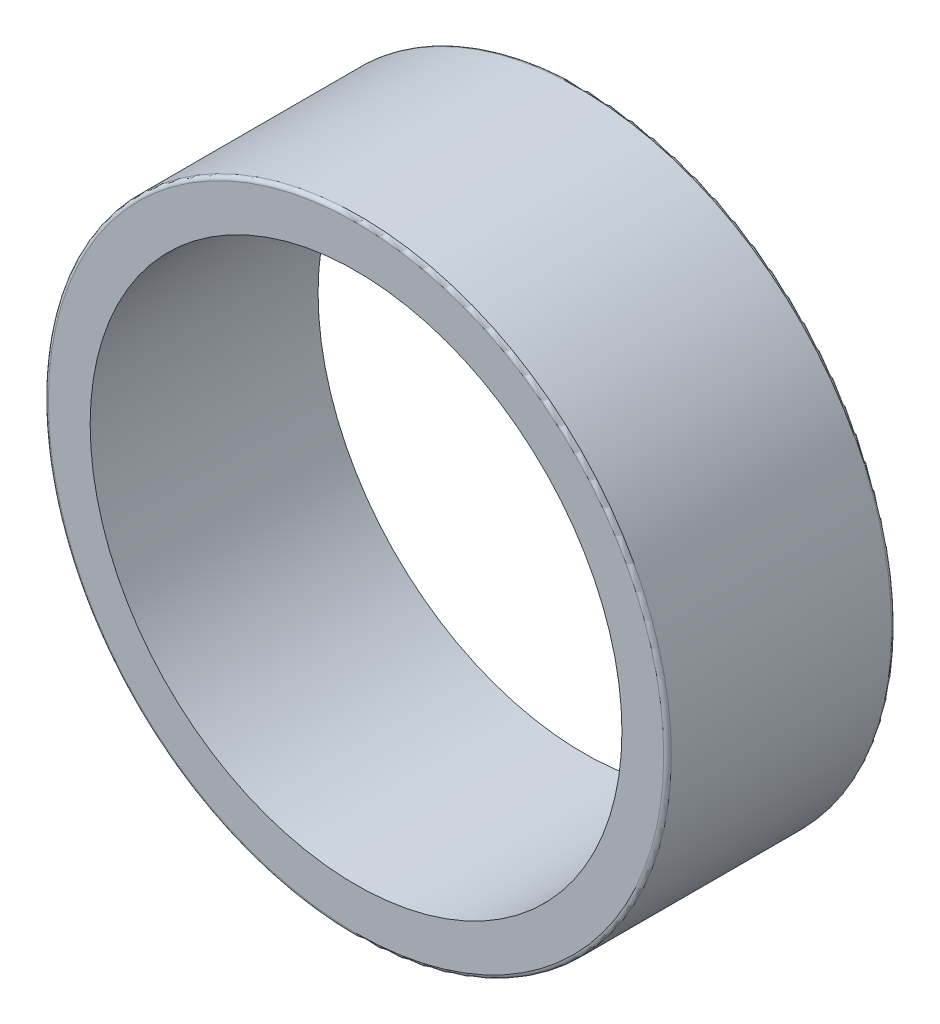
ISO-10303-21;
HEADER;
FILE_DESCRIPTION(('STEP AP214'),'2;1');
FILE_NAME('part.step','',(''),(''),'','','');
FILE_SCHEMA(('AUTOMOTIVE_DESIGN { 1 0 10303 214 1 1 1 1 }'));
ENDSEC;
DATA;
#1=APPLICATION_CONTEXT('core data for automotive mechanical design processes');
#2=APPLICATION_PROTOCOL_DEFINITION('international standard','automotive_design',2000,#1);
#3=PRODUCT_CONTEXT('',#1,'mechanical');
#4=PRODUCT('Part','Part','',(#3));
#5=PRODUCT_RELATED_PRODUCT_CATEGORY('part','',(#4));
#6=PRODUCT_DEFINITION_FORMATION('','',#4);
#7=PRODUCT_DEFINITION_CONTEXT('part definition',#1,'design');
#8=PRODUCT_DEFINITION('design','',#6,#7);
#9=PRODUCT_DEFINITION_SHAPE('','',#8);
#10=(LENGTH_UNIT() NAMED_UNIT(*) SI_UNIT(.MILLI.,.METRE.));
#11=(NAMED_UNIT(*) PLANE_ANGLE_UNIT() SI_UNIT($,.RADIAN.));
#12=(NAMED_UNIT(*) SI_UNIT($,.STERADIAN.) SOLID_ANGLE_UNIT());
#13=UNCERTAINTY_MEASURE_WITH_UNIT(LENGTH_MEASURE(1.E-05),#10,'distance_accuracy_value','');
#14=(GEOMETRIC_REPRESENTATION_CONTEXT(3) GLOBAL_UNCERTAINTY_ASSIGNED_CONTEXT((#13)) GLOBAL_UNIT_ASSIGNED_CONTEXT((#10,
#11,#12)) REPRESENTATION_CONTEXT('',''));
#15=CARTESIAN_POINT('',(0.,0.,0.));
#16=DIRECTION('',(0.,0.,1.));
#17=DIRECTION('',(1.,0.,0.));
#18=AXIS2_PLACEMENT_3D('',#15,#16,#17);
#19=CARTESIAN_POINT('',(0.,0.,1.5));
#20=DIRECTION('',(0.,0.,1.));
#21=DIRECTION('',(1.,0.,0.));
#22=AXIS2_PLACEMENT_3D('',#19,#20,#21);
#23=PLANE('',#22);
#24=CARTESIAN_POINT('',(0.,0.,1.5));
#25=DIRECTION('',(0.,0.,1.));
#26=DIRECTION('',(1.,0.,0.));
#27=AXIS2_PLACEMENT_3D('',#24,#25,#26);
#28=CIRCLE('',#27,4.05);
#29=CARTESIAN_POINT('',(4.05,0.,1.5));
#30=VERTEX_POINT('',#29);
#31=EDGE_CURVE('E10',#30,#30,#28,.T.);
#32=ORIENTED_EDGE('',*,*,#31,.T.);
#33=EDGE_LOOP('',(#32));
#34=FACE_BOUND('',#33,.T.);
#35=CARTESIAN_POINT('',(0.,0.,1.5));
#36=DIRECTION('',(0.,0.,1.));
#37=DIRECTION('',(1.,0.,0.));
#38=AXIS2_PLACEMENT_3D('',#35,#36,#37);
#39=CIRCLE('',#38,3.5);
#40=CARTESIAN_POINT('',(3.5,0.,1.5));
#41=VERTEX_POINT('',#40);
#42=EDGE_CURVE('E54',#41,#41,#39,.T.);
#43=ORIENTED_EDGE('',*,*,#42,.F.);
#44=EDGE_LOOP('',(#43));
#45=FACE_BOUND('',#44,.T.);
#46=ADVANCED_FACE('F34',(#34,#45),#23,.T.);
#47=CARTESIAN_POINT('',(0.,0.,-1.5));
#48=DIRECTION('',(0.,0.,1.));
#49=DIRECTION('',(1.,0.,0.));
#50=AXIS2_PLACEMENT_3D('',#47,#48,#49);
#51=PLANE('',#50);
#52=CARTESIAN_POINT('',(0.,0.,-1.5));
#53=DIRECTION('',(0.,0.,1.));
#54=DIRECTION('',(1.,0.,0.));
#55=AXIS2_PLACEMENT_3D('',#52,#53,#54);
#56=CIRCLE('',#55,4.05);
#57=CARTESIAN_POINT('',(4.05,0.,-1.5));
#58=VERTEX_POINT('',#57);
#59=EDGE_CURVE('E41',#58,#58,#56,.F.);
#60=ORIENTED_EDGE('',*,*,#59,.T.);
#61=EDGE_LOOP('',(#60));
#62=FACE_BOUND('',#61,.T.);
#63=CARTESIAN_POINT('',(0.,0.,-1.5));
#64=DIRECTION('',(0.,0.,1.));
#65=DIRECTION('',(1.,0.,0.));
#66=AXIS2_PLACEMENT_3D('',#63,#64,#65);
#67=CIRCLE('',#66,3.5);
#68=CARTESIAN_POINT('',(3.5,0.,-1.5));
#69=VERTEX_POINT('',#68);
#70=EDGE_CURVE('E55',#69,#69,#67,.T.);
#71=ORIENTED_EDGE('',*,*,#70,.T.);
#72=EDGE_LOOP('',(#71));
#73=FACE_BOUND('',#72,.T.);
#74=ADVANCED_FACE('F65',(#62,#73),#51,.F.);
#75=CARTESIAN_POINT('',(0.,0.,1.5));
#76=DIRECTION('',(0.,0.,-1.));
#77=DIRECTION('',(-1.,0.,0.));
#78=AXIS2_PLACEMENT_3D('',#75,#76,#77);
#79=CYLINDRICAL_SURFACE('',#78,4.1);
#80=CARTESIAN_POINT('',(0.,0.,-1.45));
#81=DIRECTION('',(0.,0.,1.));
#82=DIRECTION('',(1.,0.,0.));
#83=AXIS2_PLACEMENT_3D('',#80,#81,#82);
#84=CIRCLE('',#83,4.1);
#85=CARTESIAN_POINT('',(4.1,0.,-1.45));
#86=VERTEX_POINT('',#85);
#87=EDGE_CURVE('E45',#86,#86,#84,.T.);
#88=ORIENTED_EDGE('',*,*,#87,.T.);
#89=EDGE_LOOP('',(#88));
#90=FACE_BOUND('',#89,.T.);
#91=CARTESIAN_POINT('',(0.,0.,1.45));
#92=DIRECTION('',(0.,0.,1.));
#93=DIRECTION('',(1.,0.,0.));
#94=AXIS2_PLACEMENT_3D('',#91,#92,#93);
#95=CIRCLE('',#94,4.1);
#96=CARTESIAN_POINT('',(4.1,0.,1.45));
#97=VERTEX_POINT('',#96);
#98=EDGE_CURVE('E49',#97,#97,#95,.F.);
#99=ORIENTED_EDGE('',*,*,#98,.T.);
#100=EDGE_LOOP('',(#99));
#101=FACE_BOUND('',#100,.T.);
#102=ADVANCED_FACE('F70',(#90,#101),#79,.T.);
#103=CARTESIAN_POINT('',(0.,0.,1.5));
#104=DIRECTION('',(0.,0.,-1.));
#105=DIRECTION('',(-1.,0.,0.));
#106=AXIS2_PLACEMENT_3D('',#103,#104,#105);
#107=CYLINDRICAL_SURFACE('',#106,3.5);
#108=ORIENTED_EDGE('',*,*,#42,.T.);
#109=EDGE_LOOP('',(#108));
#110=FACE_BOUND('',#109,.T.);
#111=ORIENTED_EDGE('',*,*,#70,.F.);
#112=EDGE_LOOP('',(#111));
#113=FACE_BOUND('',#112,.T.);
#114=ADVANCED_FACE('F61',(#110,#113),#107,.F.);
#115=CARTESIAN_POINT('',(0.,0.,-1.45));
#116=DIRECTION('',(0.,0.,1.));
#117=DIRECTION('',(1.,0.,0.));
#118=AXIS2_PLACEMENT_3D('',#115,#116,#117);
#119=TOROIDAL_SURFACE('',#118,4.05,0.05);
#120=ORIENTED_EDGE('',*,*,#59,.F.);
#121=EDGE_LOOP('',(#120));
#122=FACE_BOUND('',#121,.T.);
#123=ORIENTED_EDGE('',*,*,#87,.F.);
#124=EDGE_LOOP('',(#123));
#125=FACE_BOUND('',#124,.T.);
#126=ADVANCED_FACE('F76',(#122,#125),#119,.T.);
#127=CARTESIAN_POINT('',(0.,0.,1.45));
#128=DIRECTION('',(0.,0.,1.));
#129=DIRECTION('',(1.,0.,0.));
#130=AXIS2_PLACEMENT_3D('',#127,#128,#129);
#131=TOROIDAL_SURFACE('',#130,4.05,0.05);
#132=ORIENTED_EDGE('',*,*,#98,.F.);
#133=EDGE_LOOP('',(#132));
#134=FACE_BOUND('',#133,.T.);
#135=ORIENTED_EDGE('',*,*,#31,.F.);
#136=EDGE_LOOP('',(#135));
#137=FACE_BOUND('',#136,.T.);
#138=ADVANCED_FACE('F36',(#134,#137),#131,.T.);
#139=CLOSED_SHELL('',(#46,#74,#102,#114,#126,#138));
#140=MANIFOLD_SOLID_BREP('B2',#139);
#141=ADVANCED_BREP_SHAPE_REPRESENTATION('',(#18,#140),#14);
#142=SHAPE_DEFINITION_REPRESENTATION(#9,#141);
ENDSEC;
END-ISO-10303-21;
